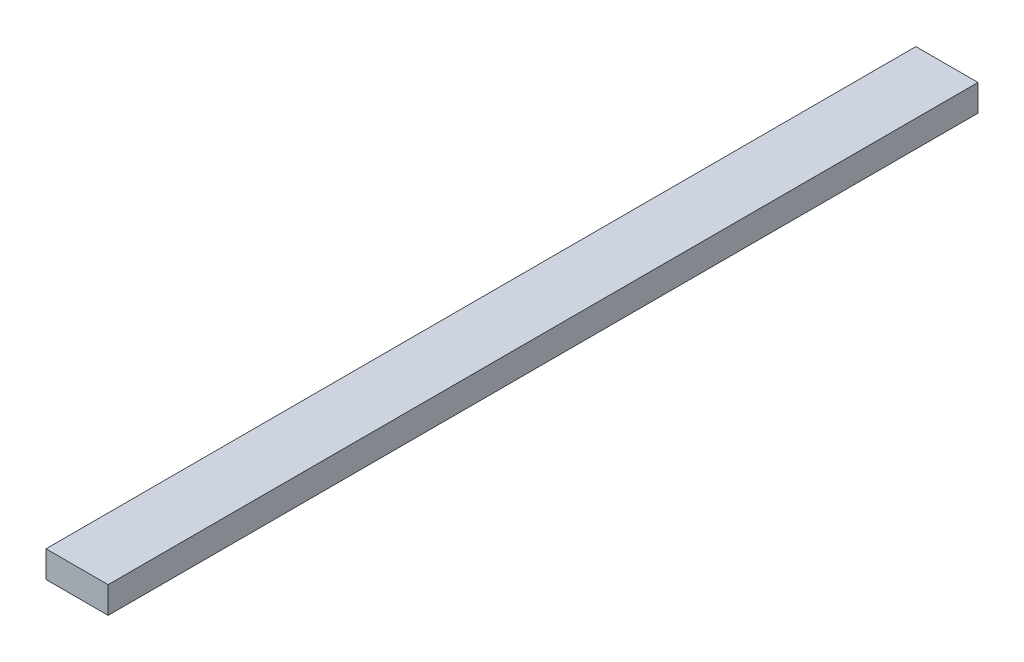
ISO-10303-21;
HEADER;
FILE_DESCRIPTION(('STEP AP214'),'2;1');
FILE_NAME('part.step','',(''),(''),'','','');
FILE_SCHEMA(('AUTOMOTIVE_DESIGN { 1 0 10303 214 1 1 1 1 }'));
ENDSEC;
DATA;
#1=APPLICATION_CONTEXT('core data for automotive mechanical design processes');
#2=APPLICATION_PROTOCOL_DEFINITION('international standard','automotive_design',2000,#1);
#3=PRODUCT_CONTEXT('',#1,'mechanical');
#4=PRODUCT('Part','Part','',(#3));
#5=PRODUCT_RELATED_PRODUCT_CATEGORY('part','',(#4));
#6=PRODUCT_DEFINITION_FORMATION('','',#4);
#7=PRODUCT_DEFINITION_CONTEXT('part definition',#1,'design');
#8=PRODUCT_DEFINITION('design','',#6,#7);
#9=PRODUCT_DEFINITION_SHAPE('','',#8);
#10=(LENGTH_UNIT() NAMED_UNIT(*) SI_UNIT(.MILLI.,.METRE.));
#11=(NAMED_UNIT(*) PLANE_ANGLE_UNIT() SI_UNIT($,.RADIAN.));
#12=(NAMED_UNIT(*) SI_UNIT($,.STERADIAN.) SOLID_ANGLE_UNIT());
#13=UNCERTAINTY_MEASURE_WITH_UNIT(LENGTH_MEASURE(1.E-05),#10,'distance_accuracy_value','');
#14=(GEOMETRIC_REPRESENTATION_CONTEXT(3) GLOBAL_UNCERTAINTY_ASSIGNED_CONTEXT((#13)) GLOBAL_UNIT_ASSIGNED_CONTEXT((#10,
#11,#12)) REPRESENTATION_CONTEXT('',''));
#15=CARTESIAN_POINT('',(0.,0.,0.));
#16=DIRECTION('',(0.,0.,1.));
#17=DIRECTION('',(1.,0.,0.));
#18=AXIS2_PLACEMENT_3D('',#15,#16,#17);
#19=CARTESIAN_POINT('',(-44.45,19.05,622.3));
#20=DIRECTION('',(1.,0.,0.));
#21=DIRECTION('',(0.,0.,-1.));
#22=AXIS2_PLACEMENT_3D('',#19,#20,#21);
#23=PLANE('',#22);
#24=DIRECTION('',(0.,-1.,0.));
#25=VECTOR('',#24,1.);
#26=CARTESIAN_POINT('',(-44.45,19.05,-622.3));
#27=LINE('',#26,#25);
#28=CARTESIAN_POINT('',(-44.45,19.05,-622.3));
#29=VERTEX_POINT('',#28);
#30=CARTESIAN_POINT('',(-44.45,-19.05,-622.3));
#31=VERTEX_POINT('',#30);
#32=EDGE_CURVE('E96',#29,#31,#27,.T.);
#33=ORIENTED_EDGE('',*,*,#32,.T.);
#34=DIRECTION('',(0.,0.,-1.));
#35=VECTOR('',#34,1.);
#36=CARTESIAN_POINT('',(-44.45,-19.05,622.3));
#37=LINE('',#36,#35);
#38=CARTESIAN_POINT('',(-44.45,-19.05,622.3));
#39=VERTEX_POINT('',#38);
#40=EDGE_CURVE('E11',#39,#31,#37,.T.);
#41=ORIENTED_EDGE('',*,*,#40,.F.);
#42=DIRECTION('',(0.,-1.,0.));
#43=VECTOR('',#42,1.);
#44=CARTESIAN_POINT('',(-44.45,19.05,622.3));
#45=LINE('',#44,#43);
#46=CARTESIAN_POINT('',(-44.45,19.05,622.3));
#47=VERTEX_POINT('',#46);
#48=EDGE_CURVE('E84',#47,#39,#45,.T.);
#49=ORIENTED_EDGE('',*,*,#48,.F.);
#50=DIRECTION('',(0.,0.,-1.));
#51=VECTOR('',#50,1.);
#52=CARTESIAN_POINT('',(-44.45,19.05,622.3));
#53=LINE('',#52,#51);
#54=EDGE_CURVE('E92',#47,#29,#53,.T.);
#55=ORIENTED_EDGE('',*,*,#54,.T.);
#56=EDGE_LOOP('',(#33,#41,#49,#55));
#57=FACE_BOUND('',#56,.T.);
#58=ADVANCED_FACE('F33',(#57),#23,.F.);
#59=CARTESIAN_POINT('',(44.45,-19.05,622.3));
#60=DIRECTION('',(0.,1.,0.));
#61=DIRECTION('',(-1.,0.,0.));
#62=AXIS2_PLACEMENT_3D('',#59,#60,#61);
#63=PLANE('',#62);
#64=DIRECTION('',(1.,0.,0.));
#65=VECTOR('',#64,1.);
#66=CARTESIAN_POINT('',(44.45,-19.05,-622.3));
#67=LINE('',#66,#65);
#68=CARTESIAN_POINT('',(44.45,-19.05,-622.3));
#69=VERTEX_POINT('',#68);
#70=EDGE_CURVE('E88',#31,#69,#67,.T.);
#71=ORIENTED_EDGE('',*,*,#70,.T.);
#72=DIRECTION('',(0.,0.,-1.));
#73=VECTOR('',#72,1.);
#74=CARTESIAN_POINT('',(44.45,-19.05,622.3));
#75=LINE('',#74,#73);
#76=CARTESIAN_POINT('',(44.45,-19.05,622.3));
#77=VERTEX_POINT('',#76);
#78=EDGE_CURVE('E41',#77,#69,#75,.T.);
#79=ORIENTED_EDGE('',*,*,#78,.F.);
#80=DIRECTION('',(1.,0.,0.));
#81=VECTOR('',#80,1.);
#82=CARTESIAN_POINT('',(44.45,-19.05,622.3));
#83=LINE('',#82,#81);
#84=EDGE_CURVE('E79',#39,#77,#83,.T.);
#85=ORIENTED_EDGE('',*,*,#84,.F.);
#86=ORIENTED_EDGE('',*,*,#40,.T.);
#87=EDGE_LOOP('',(#71,#79,#85,#86));
#88=FACE_BOUND('',#87,.T.);
#89=ADVANCED_FACE('F87',(#88),#63,.F.);
#90=CARTESIAN_POINT('',(44.45,19.05,622.3));
#91=DIRECTION('',(-1.,0.,0.));
#92=DIRECTION('',(0.,-1.,0.));
#93=AXIS2_PLACEMENT_3D('',#90,#91,#92);
#94=PLANE('',#93);
#95=DIRECTION('',(0.,1.,0.));
#96=VECTOR('',#95,1.);
#97=CARTESIAN_POINT('',(44.45,19.05,-622.3));
#98=LINE('',#97,#96);
#99=CARTESIAN_POINT('',(44.45,19.05,-622.3));
#100=VERTEX_POINT('',#99);
#101=EDGE_CURVE('E66',#69,#100,#98,.T.);
#102=ORIENTED_EDGE('',*,*,#101,.T.);
#103=DIRECTION('',(0.,0.,-1.));
#104=VECTOR('',#103,1.);
#105=CARTESIAN_POINT('',(44.45,19.05,622.3));
#106=LINE('',#105,#104);
#107=CARTESIAN_POINT('',(44.45,19.05,622.3));
#108=VERTEX_POINT('',#107);
#109=EDGE_CURVE('E89',#108,#100,#106,.T.);
#110=ORIENTED_EDGE('',*,*,#109,.F.);
#111=DIRECTION('',(0.,1.,0.));
#112=VECTOR('',#111,1.);
#113=CARTESIAN_POINT('',(44.45,19.05,622.3));
#114=LINE('',#113,#112);
#115=EDGE_CURVE('E82',#77,#108,#114,.T.);
#116=ORIENTED_EDGE('',*,*,#115,.F.);
#117=ORIENTED_EDGE('',*,*,#78,.T.);
#118=EDGE_LOOP('',(#102,#110,#116,#117));
#119=FACE_BOUND('',#118,.T.);
#120=ADVANCED_FACE('F90',(#119),#94,.F.);
#121=CARTESIAN_POINT('',(44.45,19.05,622.3));
#122=DIRECTION('',(0.,-1.,0.));
#123=DIRECTION('',(1.,0.,0.));
#124=AXIS2_PLACEMENT_3D('',#121,#122,#123);
#125=PLANE('',#124);
#126=DIRECTION('',(-1.,0.,0.));
#127=VECTOR('',#126,1.);
#128=CARTESIAN_POINT('',(44.45,19.05,-622.3));
#129=LINE('',#128,#127);
#130=EDGE_CURVE('E72',#100,#29,#129,.T.);
#131=ORIENTED_EDGE('',*,*,#130,.T.);
#132=ORIENTED_EDGE('',*,*,#54,.F.);
#133=DIRECTION('',(-1.,0.,0.));
#134=VECTOR('',#133,1.);
#135=CARTESIAN_POINT('',(44.45,19.05,622.3));
#136=LINE('',#135,#134);
#137=EDGE_CURVE('E49',#108,#47,#136,.T.);
#138=ORIENTED_EDGE('',*,*,#137,.F.);
#139=ORIENTED_EDGE('',*,*,#109,.T.);
#140=EDGE_LOOP('',(#131,#132,#138,#139));
#141=FACE_BOUND('',#140,.T.);
#142=ADVANCED_FACE('F103',(#141),#125,.F.);
#143=CARTESIAN_POINT('',(0.,0.,622.3));
#144=DIRECTION('',(0.,0.,-1.));
#145=DIRECTION('',(-1.,0.,0.));
#146=AXIS2_PLACEMENT_3D('',#143,#144,#145);
#147=PLANE('',#146);
#148=ORIENTED_EDGE('',*,*,#48,.T.);
#149=ORIENTED_EDGE('',*,*,#84,.T.);
#150=ORIENTED_EDGE('',*,*,#115,.T.);
#151=ORIENTED_EDGE('',*,*,#137,.T.);
#152=EDGE_LOOP('',(#148,#149,#150,#151));
#153=FACE_BOUND('',#152,.T.);
#154=ADVANCED_FACE('F80',(#153),#147,.F.);
#155=CARTESIAN_POINT('',(0.,0.,-622.3));
#156=DIRECTION('',(0.,0.,-1.));
#157=DIRECTION('',(-1.,0.,0.));
#158=AXIS2_PLACEMENT_3D('',#155,#156,#157);
#159=PLANE('',#158);
#160=ORIENTED_EDGE('',*,*,#32,.F.);
#161=ORIENTED_EDGE('',*,*,#130,.F.);
#162=ORIENTED_EDGE('',*,*,#101,.F.);
#163=ORIENTED_EDGE('',*,*,#70,.F.);
#164=EDGE_LOOP('',(#160,#161,#162,#163));
#165=FACE_BOUND('',#164,.T.);
#166=ADVANCED_FACE('F106',(#165),#159,.T.);
#167=CLOSED_SHELL('',(#58,#89,#120,#142,#154,#166));
#168=MANIFOLD_SOLID_BREP('B2',#167);
#169=ADVANCED_BREP_SHAPE_REPRESENTATION('',(#18,#168),#14);
#170=SHAPE_DEFINITION_REPRESENTATION(#9,#169);
ENDSEC;
END-ISO-10303-21;
